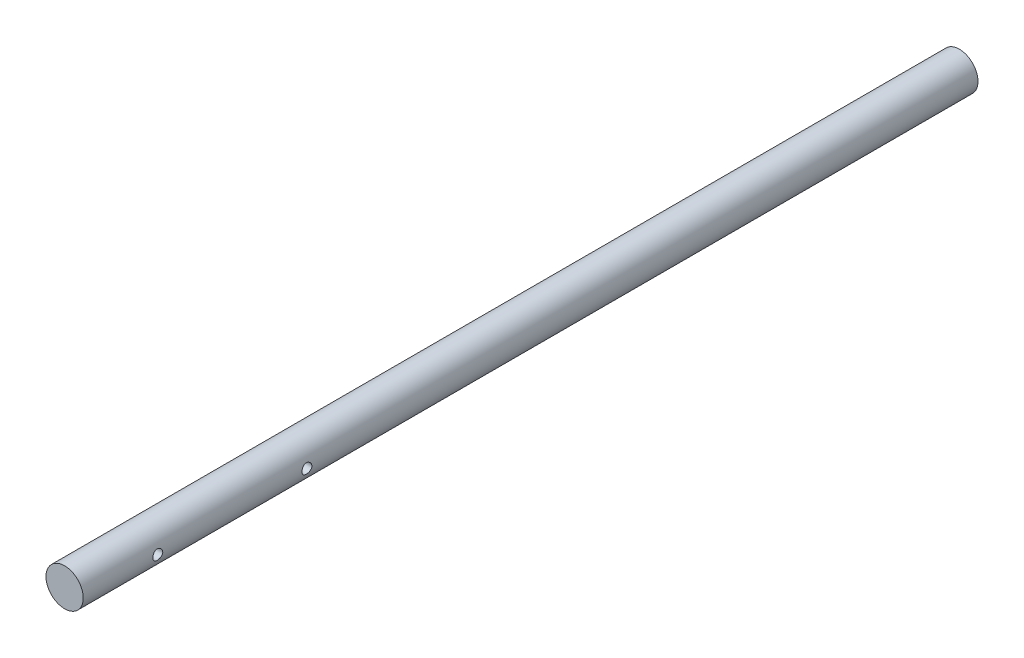
ISO-10303-21;
HEADER;
FILE_DESCRIPTION(('STEP AP214'),'2;1');
FILE_NAME('part.step','',(''),(''),'','','');
FILE_SCHEMA(('AUTOMOTIVE_DESIGN { 1 0 10303 214 1 1 1 1 }'));
ENDSEC;
DATA;
#1=APPLICATION_CONTEXT('core data for automotive mechanical design processes');
#2=APPLICATION_PROTOCOL_DEFINITION('international standard','automotive_design',2000,#1);
#3=PRODUCT_CONTEXT('',#1,'mechanical');
#4=PRODUCT('Part','Part','',(#3));
#5=PRODUCT_RELATED_PRODUCT_CATEGORY('part','',(#4));
#6=PRODUCT_DEFINITION_FORMATION('','',#4);
#7=PRODUCT_DEFINITION_CONTEXT('part definition',#1,'design');
#8=PRODUCT_DEFINITION('design','',#6,#7);
#9=PRODUCT_DEFINITION_SHAPE('','',#8);
#10=(LENGTH_UNIT() NAMED_UNIT(*) SI_UNIT(.MILLI.,.METRE.));
#11=(NAMED_UNIT(*) PLANE_ANGLE_UNIT() SI_UNIT($,.RADIAN.));
#12=(NAMED_UNIT(*) SI_UNIT($,.STERADIAN.) SOLID_ANGLE_UNIT());
#13=UNCERTAINTY_MEASURE_WITH_UNIT(LENGTH_MEASURE(1.E-05),#10,'distance_accuracy_value','');
#14=(GEOMETRIC_REPRESENTATION_CONTEXT(3) GLOBAL_UNCERTAINTY_ASSIGNED_CONTEXT((#13)) GLOBAL_UNIT_ASSIGNED_CONTEXT((#10,
#11,#12)) REPRESENTATION_CONTEXT('',''));
#15=CARTESIAN_POINT('',(0.,0.,0.));
#16=DIRECTION('',(0.,0.,1.));
#17=DIRECTION('',(1.,0.,0.));
#18=AXIS2_PLACEMENT_3D('',#15,#16,#17);
#19=CARTESIAN_POINT('',(-21.6856532851396,-1.03694830499993E-10,1143.));
#20=DIRECTION('',(0.,0.,1.));
#21=DIRECTION('',(1.,0.,0.));
#22=AXIS2_PLACEMENT_3D('',#19,#20,#21);
#23=PLANE('',#22);
#24=CARTESIAN_POINT('',(0.,0.,1143.));
#25=DIRECTION('',(0.,0.,1.));
#26=DIRECTION('',(1.,0.,0.));
#27=AXIS2_PLACEMENT_3D('',#24,#25,#26);
#28=CIRCLE('',#27,12.7);
#29=CARTESIAN_POINT('',(12.7,0.,1143.));
#30=VERTEX_POINT('',#29);
#31=EDGE_CURVE('E53',#30,#30,#28,.F.);
#32=ORIENTED_EDGE('',*,*,#31,.F.);
#33=EDGE_LOOP('',(#32));
#34=FACE_BOUND('',#33,.T.);
#35=ADVANCED_FACE('F14',(#34),#23,.T.);
#36=CARTESIAN_POINT('',(-25.4,0.,1092.2));
#37=DIRECTION('',(-1.,0.,0.));
#38=DIRECTION('',(0.,0.,1.));
#39=AXIS2_PLACEMENT_3D('',#36,#37,#38);
#40=CYLINDRICAL_SURFACE('',#39,3.3782);
#41=CARTESIAN_POINT('',(12.7,0.,1088.8218));
#42=CARTESIAN_POINT('',(12.6999933605372,-0.186020342606474,1088.82181128459));
#43=CARTESIAN_POINT('',(12.695867332988,-0.372262464096379,1088.83723465276));
#44=CARTESIAN_POINT('',(12.6797877928463,-0.73955021698108,1088.89847139542));
#45=CARTESIAN_POINT('',(12.6678198266184,-0.920585607317159,1088.94434088781));
#46=CARTESIAN_POINT('',(12.6373814223825,-1.27185364063102,1089.06487267551));
#47=CARTESIAN_POINT('',(12.6189228160807,-1.44210527918118,1089.13948260371));
#48=CARTESIAN_POINT('',(12.5774590112802,-1.76762100050872,1089.31521688562));
#49=CARTESIAN_POINT('',(12.554454874331,-1.9228885700428,1089.41633505048));
#50=CARTESIAN_POINT('',(12.5057836689968,-2.21769770214195,1089.64470428743));
#51=CARTESIAN_POINT('',(12.4800710423938,-2.35684340313235,1089.77245674211));
#52=CARTESIAN_POINT('',(12.4291728915324,-2.61201629178009,1090.0494023366));
#53=CARTESIAN_POINT('',(12.403987464545,-2.72803924624599,1090.1985993938));
#54=CARTESIAN_POINT('',(12.3565343877839,-2.93557815837609,1090.517328292));
#55=CARTESIAN_POINT('',(12.3343238259698,-3.02664240497215,1090.68716354336));
#56=CARTESIAN_POINT('',(12.2960004660737,-3.17876856491222,1091.04041888794));
#57=CARTESIAN_POINT('',(12.2798865050478,-3.23983620085826,1091.22383638231));
#58=CARTESIAN_POINT('',(12.256048138663,-3.32887077256238,1091.59469324629));
#59=CARTESIAN_POINT('',(12.2481432559455,-3.35755104395233,1091.78194947668));
#60=CARTESIAN_POINT('',(12.2410788191836,-3.38322058468691,1092.15876976435));
#61=CARTESIAN_POINT('',(12.2419176492131,-3.38021570976413,1092.34833338875));
#62=CARTESIAN_POINT('',(12.2520842824537,-3.34316670790743,1092.71882209512));
#63=CARTESIAN_POINT('',(12.2611760874246,-3.30998544183696,1092.89984096847));
#64=CARTESIAN_POINT('',(12.2864465364999,-3.2149071681195,1093.25364623992));
#65=CARTESIAN_POINT('',(12.3026257886389,-3.15300769670125,1093.42643193027));
#66=CARTESIAN_POINT('',(12.3404565781244,-3.00154277190052,1093.76112144869));
#67=CARTESIAN_POINT('',(12.3621676889753,-2.91167361214975,1093.92288081994));
#68=CARTESIAN_POINT('',(12.4085819523928,-2.70704174121837,1094.22931570236));
#69=CARTESIAN_POINT('',(12.4332854980099,-2.59227575831941,1094.37398896434));
#70=CARTESIAN_POINT('',(12.4838810974769,-2.33670212039094,1094.64706635612));
#71=CARTESIAN_POINT('',(12.5097857752129,-2.19517342135551,1094.77479456243));
#72=CARTESIAN_POINT('',(12.5591598914828,-1.89236412155247,1095.00488738205));
#73=CARTESIAN_POINT('',(12.5826282831934,-1.73107509452933,1095.10724111847));
#74=CARTESIAN_POINT('',(12.6246345743652,-1.39204813311243,1095.28400603407));
#75=CARTESIAN_POINT('',(12.6431469899537,-1.2142312840605,1095.3582735694));
#76=CARTESIAN_POINT('',(12.6655031094471,-0.939953184573135,1095.44622406083));
#77=CARTESIAN_POINT('',(12.672051334521,-0.84731172458922,1095.47162625975));
#78=CARTESIAN_POINT('',(12.6831789147544,-0.660102960139958,1095.51446832995));
#79=CARTESIAN_POINT('',(12.6877591818953,-0.565536569043097,1095.53191188962));
#80=CARTESIAN_POINT('',(12.6941721666659,-0.392513241549019,1095.55624078169));
#81=CARTESIAN_POINT('',(12.6963531146455,-0.314254991285739,1095.56446949455));
#82=CARTESIAN_POINT('',(12.6992684375657,-0.157344390753286,1095.57545149779));
#83=CARTESIAN_POINT('',(12.7000028086869,-0.0786920394440842,1095.57820477371));
#84=CARTESIAN_POINT('',(12.6999933605369,0.186020342623133,1095.57818871541));
#85=CARTESIAN_POINT('',(12.6958673329875,0.372262464109051,1095.56276534724));
#86=CARTESIAN_POINT('',(12.679787792846,0.739550216985838,1095.50152860458));
#87=CARTESIAN_POINT('',(12.6678198266183,0.920585607317989,1095.45565911219));
#88=CARTESIAN_POINT('',(12.6373814223828,1.27185364062774,1095.33512732449));
#89=CARTESIAN_POINT('',(12.6189228160812,1.44210527917753,1095.2605173963));
#90=CARTESIAN_POINT('',(12.5774590112808,1.76762100050446,1095.08478311438));
#91=CARTESIAN_POINT('',(12.5544548743317,1.9228885700383,1094.98366494952));
#92=CARTESIAN_POINT('',(12.5057836689976,2.21769770213743,1094.75529571257));
#93=CARTESIAN_POINT('',(12.4800710423946,2.35684340312802,1094.6275432579));
#94=CARTESIAN_POINT('',(12.4291728915333,2.61201629177625,1094.3505976634));
#95=CARTESIAN_POINT('',(12.4039874645458,2.72803924624242,1094.20140060621));
#96=CARTESIAN_POINT('',(12.3565343877847,2.93557815837312,1093.88267170801));
#97=CARTESIAN_POINT('',(12.3343238259705,3.02664240496951,1093.71283645665));
#98=CARTESIAN_POINT('',(12.2960004660742,3.17876856491018,1093.35958111207));
#99=CARTESIAN_POINT('',(12.2798865050483,3.2398362008565,1093.1761636177));
#100=CARTESIAN_POINT('',(12.2560481386633,3.3288707725613,1092.80530675371));
#101=CARTESIAN_POINT('',(12.2481432559457,3.3575510439516,1092.61805052333));
#102=CARTESIAN_POINT('',(12.2410788191836,3.38322058468684,1092.24123023565));
#103=CARTESIAN_POINT('',(12.241917649213,3.38021570976439,1092.05166661126));
#104=CARTESIAN_POINT('',(12.2520842824534,3.34316670790833,1091.68117790489));
#105=CARTESIAN_POINT('',(12.2611760874242,3.30998544183818,1091.50015903153));
#106=CARTESIAN_POINT('',(12.2864465364995,3.21490716812133,1091.14635376009));
#107=CARTESIAN_POINT('',(12.3026257886383,3.15300769670333,1090.97356806974));
#108=CARTESIAN_POINT('',(12.3404565781237,3.00154277190315,1090.63887855132));
#109=CARTESIAN_POINT('',(12.3621676889746,2.91167361215269,1090.47711918006));
#110=CARTESIAN_POINT('',(12.408581952392,2.70704174122187,1090.17068429765));
#111=CARTESIAN_POINT('',(12.4332854980091,2.59227575832314,1090.02601103566));
#112=CARTESIAN_POINT('',(12.4838810974761,2.33670212039518,1089.75293364388));
#113=CARTESIAN_POINT('',(12.5097857752121,2.19517342136,1089.62520543758));
#114=CARTESIAN_POINT('',(12.559159891482,1.89236412155745,1089.39511261795));
#115=CARTESIAN_POINT('',(12.5826282831927,1.73107509453454,1089.29275888153));
#116=CARTESIAN_POINT('',(12.6246345743646,1.39204813311795,1089.11599396594));
#117=CARTESIAN_POINT('',(12.6431469899532,1.21423128406609,1089.04172643061));
#118=CARTESIAN_POINT('',(12.6655031094467,0.939953184578927,1088.95377593917));
#119=CARTESIAN_POINT('',(12.6720513345206,0.847311724595088,1088.92837374025));
#120=CARTESIAN_POINT('',(12.6831789147541,0.660102960145911,1088.88553167005));
#121=CARTESIAN_POINT('',(12.687759181895,0.565536569049061,1088.86808811038));
#122=CARTESIAN_POINT('',(12.6941721666657,0.392513241557402,1088.84375921832));
#123=CARTESIAN_POINT('',(12.6963531146452,0.314254991296555,1088.83553050545));
#124=CARTESIAN_POINT('',(12.6992684375655,0.15734439076897,1088.82454850221));
#125=CARTESIAN_POINT('',(12.7000028086867,0.0786920394622045,1088.82179522629));
#126=CARTESIAN_POINT('',(12.7,0.,1088.8218));
#127=B_SPLINE_CURVE_WITH_KNOTS('',3,(#41,#42,#43,#44,#45,#46,#47,#48,#49,#50,#51,#52,#53,#54,
#55,#56,#57,#58,#59,#60,#61,#62,#63,#64,#65,#66,#67,#68,#69,#70,#71,#72,#73,#74,#75,#76,#77,#78,
#79,#80,#81,#82,#83,#84,#85,#86,#87,#88,#89,#90,#91,#92,#93,#94,#95,#96,#97,#98,#99,#100,#101,
#102,#103,#104,#105,#106,#107,#108,#109,#110,#111,#112,#113,#114,#115,#116,#117,#118,#119,#120,
#121,#122,#123,#124,#125,#126),.UNSPECIFIED.,.T.,.F.,(4,2,2,2,2,2,2,2,2,2,2,2,2,2,2,2,2,2,2,2,2,
2,2,2,2,2,2,2,2,2,2,2,2,2,2,2,2,2,2,2,2,2,4),(0.,0.557772027578806,1.11657499878165,
1.67436457110117,2.2320240325689,2.80132264926697,3.37072539462766,3.94983922959498,
4.52884254119642,5.09482809499832,5.6607090508311,6.21090117790003,6.76114051538032,
7.31757629124609,7.87408523327904,8.44855842732994,9.02327744813122,9.60089728563721,
9.88944767046528,10.1778641921096,10.4138174319529,10.6497712948019,11.2075433223691,
11.7663462935602,12.3241358658781,12.8817953273444,13.4510939440422,14.0204966894033,
14.5996105243707,15.1786138359718,15.7445993897741,16.3104803456068,16.8606724726756,
17.4109118101562,17.9673475860217,18.5238565280545,19.0983297221055,19.6730487429067,
20.2506685804126,20.5392189652407,20.8276354868851,21.0635887267212,21.2995425895629),.UNSPECIFIED.);
#128=CARTESIAN_POINT('',(12.7,0.,1088.8218));
#129=VERTEX_POINT('',#128);
#130=EDGE_CURVE('E49',#129,#129,#127,.T.);
#131=ORIENTED_EDGE('',*,*,#130,.F.);
#132=EDGE_LOOP('',(#131));
#133=FACE_BOUND('',#132,.T.);
#134=CARTESIAN_POINT('',(-12.7,0.,1095.5782));
#135=CARTESIAN_POINT('',(-12.6999933605372,-0.186020342606473,1095.57818871541));
#136=CARTESIAN_POINT('',(-12.695867332988,-0.372262464096378,1095.56276534724));
#137=CARTESIAN_POINT('',(-12.6797877928463,-0.739550216981078,1095.50152860458));
#138=CARTESIAN_POINT('',(-12.6678198266184,-0.920585607317157,1095.45565911219));
#139=CARTESIAN_POINT('',(-12.6373814223825,-1.27185364063101,1095.33512732449));
#140=CARTESIAN_POINT('',(-12.6189228160807,-1.44210527918118,1095.26051739629));
#141=CARTESIAN_POINT('',(-12.5774590112803,-1.76762100050872,1095.08478311438));
#142=CARTESIAN_POINT('',(-12.554454874331,-1.9228885700428,1094.98366494952));
#143=CARTESIAN_POINT('',(-12.5057836689968,-2.21769770214194,1094.75529571257));
#144=CARTESIAN_POINT('',(-12.4800710423938,-2.35684340313235,1094.62754325789));
#145=CARTESIAN_POINT('',(-12.4291728915324,-2.61201629178009,1094.3505976634));
#146=CARTESIAN_POINT('',(-12.403987464545,-2.72803924624598,1094.2014006062));
#147=CARTESIAN_POINT('',(-12.3565343877839,-2.93557815837609,1093.882671708));
#148=CARTESIAN_POINT('',(-12.3343238259698,-3.02664240497215,1093.71283645664));
#149=CARTESIAN_POINT('',(-12.2960004660737,-3.17876856491222,1093.35958111206));
#150=CARTESIAN_POINT('',(-12.2798865050478,-3.23983620085826,1093.17616361769));
#151=CARTESIAN_POINT('',(-12.256048138663,-3.32887077256238,1092.80530675371));
#152=CARTESIAN_POINT('',(-12.2481432559455,-3.35755104395233,1092.61805052332));
#153=CARTESIAN_POINT('',(-12.2410788191836,-3.38322058468691,1092.24123023565));
#154=CARTESIAN_POINT('',(-12.2419176492131,-3.38021570976413,1092.05166661125));
#155=CARTESIAN_POINT('',(-12.2520842824537,-3.34316670790743,1091.68117790488));
#156=CARTESIAN_POINT('',(-12.2611760874246,-3.30998544183696,1091.50015903153));
#157=CARTESIAN_POINT('',(-12.2864465364999,-3.2149071681195,1091.14635376008));
#158=CARTESIAN_POINT('',(-12.3026257886389,-3.15300769670125,1090.97356806973));
#159=CARTESIAN_POINT('',(-12.3404565781244,-3.00154277190052,1090.63887855131));
#160=CARTESIAN_POINT('',(-12.3621676889753,-2.91167361214975,1090.47711918006));
#161=CARTESIAN_POINT('',(-12.4085819523928,-2.70704174121837,1090.17068429764));
#162=CARTESIAN_POINT('',(-12.4332854980099,-2.59227575831941,1090.02601103566));
#163=CARTESIAN_POINT('',(-12.4838810974769,-2.33670212039094,1089.75293364388));
#164=CARTESIAN_POINT('',(-12.5097857752129,-2.19517342135551,1089.62520543757));
#165=CARTESIAN_POINT('',(-12.5591598914828,-1.89236412155247,1089.39511261795));
#166=CARTESIAN_POINT('',(-12.5826282831934,-1.73107509452933,1089.29275888153));
#167=CARTESIAN_POINT('',(-12.6246345743652,-1.39204813311243,1089.11599396593));
#168=CARTESIAN_POINT('',(-12.6431469899537,-1.2142312840605,1089.0417264306));
#169=CARTESIAN_POINT('',(-12.6655031094471,-0.939953184573136,1088.95377593917));
#170=CARTESIAN_POINT('',(-12.672051334521,-0.847311724589221,1088.92837374025));
#171=CARTESIAN_POINT('',(-12.6831789147544,-0.66010296013996,1088.88553167005));
#172=CARTESIAN_POINT('',(-12.6877591818953,-0.565536569043099,1088.86808811038));
#173=CARTESIAN_POINT('',(-12.6941721666659,-0.392513241549015,1088.84375921831));
#174=CARTESIAN_POINT('',(-12.6963531146455,-0.31425499128573,1088.83553050545));
#175=CARTESIAN_POINT('',(-12.6992684375657,-0.157344390753275,1088.82454850221));
#176=CARTESIAN_POINT('',(-12.7000028086869,-0.0786920394440777,1088.82179522629));
#177=CARTESIAN_POINT('',(-12.6999933605369,0.186020342623135,1088.82181128459));
#178=CARTESIAN_POINT('',(-12.6958673329875,0.372262464109053,1088.83723465276));
#179=CARTESIAN_POINT('',(-12.679787792846,0.73955021698584,1088.89847139542));
#180=CARTESIAN_POINT('',(-12.6678198266183,0.920585607317993,1088.94434088781));
#181=CARTESIAN_POINT('',(-12.6373814223828,1.27185364062774,1089.06487267551));
#182=CARTESIAN_POINT('',(-12.6189228160812,1.44210527917753,1089.1394826037));
#183=CARTESIAN_POINT('',(-12.5774590112808,1.76762100050446,1089.31521688562));
#184=CARTESIAN_POINT('',(-12.5544548743317,1.92288857003831,1089.41633505048));
#185=CARTESIAN_POINT('',(-12.5057836689976,2.21769770213748,1089.64470428743));
#186=CARTESIAN_POINT('',(-12.4800710423946,2.35684340312809,1089.7724567421));
#187=CARTESIAN_POINT('',(-12.4291728915332,2.61201629177629,1090.0494023366));
#188=CARTESIAN_POINT('',(-12.4039874645458,2.72803924624245,1090.19859939379));
#189=CARTESIAN_POINT('',(-12.3565343877846,2.93557815837313,1090.51732829199));
#190=CARTESIAN_POINT('',(-12.3343238259705,3.02664240496952,1090.68716354335));
#191=CARTESIAN_POINT('',(-12.2960004660742,3.17876856491017,1091.04041888793));
#192=CARTESIAN_POINT('',(-12.2798865050483,3.2398362008565,1091.22383638231));
#193=CARTESIAN_POINT('',(-12.2560481386633,3.3288707725613,1091.59469324629));
#194=CARTESIAN_POINT('',(-12.2481432559457,3.3575510439516,1091.78194947667));
#195=CARTESIAN_POINT('',(-12.2410788191836,3.38322058468684,1092.15876976435));
#196=CARTESIAN_POINT('',(-12.241917649213,3.38021570976439,1092.34833338874));
#197=CARTESIAN_POINT('',(-12.2520842824534,3.34316670790833,1092.71882209511));
#198=CARTESIAN_POINT('',(-12.2611760874242,3.30998544183818,1092.89984096847));
#199=CARTESIAN_POINT('',(-12.2864465364995,3.21490716812133,1093.25364623991));
#200=CARTESIAN_POINT('',(-12.3026257886383,3.15300769670333,1093.42643193026));
#201=CARTESIAN_POINT('',(-12.3404565781237,3.00154277190315,1093.76112144868));
#202=CARTESIAN_POINT('',(-12.3621676889746,2.91167361215269,1093.92288081994));
#203=CARTESIAN_POINT('',(-12.408581952392,2.70704174122187,1094.22931570235));
#204=CARTESIAN_POINT('',(-12.4332854980091,2.59227575832314,1094.37398896434));
#205=CARTESIAN_POINT('',(-12.4838810974761,2.33670212039518,1094.64706635612));
#206=CARTESIAN_POINT('',(-12.5097857752121,2.19517342136,1094.77479456242));
#207=CARTESIAN_POINT('',(-12.559159891482,1.89236412155745,1095.00488738205));
#208=CARTESIAN_POINT('',(-12.5826282831927,1.73107509453454,1095.10724111847));
#209=CARTESIAN_POINT('',(-12.6246345743646,1.39204813311794,1095.28400603406));
#210=CARTESIAN_POINT('',(-12.6431469899532,1.21423128406609,1095.35827356939));
#211=CARTESIAN_POINT('',(-12.6655031094467,0.939953184578925,1095.44622406083));
#212=CARTESIAN_POINT('',(-12.6720513345206,0.847311724595087,1095.47162625975));
#213=CARTESIAN_POINT('',(-12.6831789147541,0.66010296014591,1095.51446832995));
#214=CARTESIAN_POINT('',(-12.687759181895,0.565536569049058,1095.53191188962));
#215=CARTESIAN_POINT('',(-12.6941721666657,0.3925132415574,1095.55624078168));
#216=CARTESIAN_POINT('',(-12.6963531146452,0.314254991296554,1095.56446949455));
#217=CARTESIAN_POINT('',(-12.6992684375655,0.15734439076897,1095.57545149779));
#218=CARTESIAN_POINT('',(-12.7000028086867,0.0786920394622056,1095.57820477371));
#219=CARTESIAN_POINT('',(-12.7,0.,1095.5782));
#220=B_SPLINE_CURVE_WITH_KNOTS('',3,(#134,#135,#136,#137,#138,#139,#140,#141,#142,#143,#144,
#145,#146,#147,#148,#149,#150,#151,#152,#153,#154,#155,#156,#157,#158,#159,#160,#161,#162,#163,
#164,#165,#166,#167,#168,#169,#170,#171,#172,#173,#174,#175,#176,#177,#178,#179,#180,#181,#182,
#183,#184,#185,#186,#187,#188,#189,#190,#191,#192,#193,#194,#195,#196,#197,#198,#199,#200,#201,
#202,#203,#204,#205,#206,#207,#208,#209,#210,#211,#212,#213,#214,#215,#216,#217,#218,#219),
.UNSPECIFIED.,.T.,.F.,(4,2,2,2,2,2,2,2,2,2,2,2,2,2,2,2,2,2,2,2,2,2,2,2,2,2,2,2,2,2,2,2,2,2,2,2,
2,2,2,2,2,2,4),(0.,0.557772027578806,1.11657499878165,1.67436457110117,2.2320240325689,
2.80132264926697,3.37072539462766,3.94983922959499,4.52884254119643,5.09482809499832,
5.6607090508311,6.21090117790003,6.76114051538032,7.31757629124609,7.87408523327904,
8.44855842732994,9.02327744813122,9.60089728563721,9.88944767046528,10.1778641921096,
10.4138174319529,10.6497712948019,11.2075433223691,11.7663462935602,12.3241358658781,
12.8817953273444,13.4510939440425,14.0204966894033,14.5996105243707,15.1786138359718,
15.7445993897741,16.3104803456068,16.8606724726756,17.4109118101562,17.9673475860217,
18.5238565280545,19.0983297221055,19.6730487429067,20.2506685804126,20.5392189652407,
20.8276354868851,21.0635887267212,21.2995425895629),.UNSPECIFIED.);
#221=CARTESIAN_POINT('',(-12.7,0.,1095.5782));
#222=VERTEX_POINT('',#221);
#223=EDGE_CURVE('E30',#222,#222,#220,.T.);
#224=ORIENTED_EDGE('',*,*,#223,.F.);
#225=EDGE_LOOP('',(#224));
#226=FACE_BOUND('',#225,.T.);
#227=ADVANCED_FACE('F54',(#133,#226),#40,.F.);
#228=CARTESIAN_POINT('',(-25.4,0.,990.6));
#229=DIRECTION('',(-1.,0.,0.));
#230=DIRECTION('',(0.,0.,1.));
#231=AXIS2_PLACEMENT_3D('',#228,#229,#230);
#232=CYLINDRICAL_SURFACE('',#231,3.3782);
#233=CARTESIAN_POINT('',(12.7,0.,987.2218));
#234=CARTESIAN_POINT('',(12.6999933605372,-0.186020342606472,987.221811284591));
#235=CARTESIAN_POINT('',(12.695867332988,-0.372262464096388,987.23723465276));
#236=CARTESIAN_POINT('',(12.6797877928463,-0.739550216981074,987.298471395422));
#237=CARTESIAN_POINT('',(12.6678198266184,-0.920585607317128,987.344340887814));
#238=CARTESIAN_POINT('',(12.6373814223825,-1.27185364063097,987.464872675508));
#239=CARTESIAN_POINT('',(12.6189228160807,-1.44210527918115,987.539482603706));
#240=CARTESIAN_POINT('',(12.5774590112803,-1.76762100050868,987.715216885621));
#241=CARTESIAN_POINT('',(12.554454874331,-1.92288857004274,987.816335050482));
#242=CARTESIAN_POINT('',(12.5057836689968,-2.21769770214186,988.044704287434));
#243=CARTESIAN_POINT('',(12.4800710423938,-2.35684340313227,988.172456742108));
#244=CARTESIAN_POINT('',(12.4291728915324,-2.61201629178005,988.449402336601));
#245=CARTESIAN_POINT('',(12.403987464545,-2.72803924624597,988.598599393796));
#246=CARTESIAN_POINT('',(12.3565343877839,-2.93557815837612,988.917328292));
#247=CARTESIAN_POINT('',(12.3343238259698,-3.02664240497223,989.08716354336));
#248=CARTESIAN_POINT('',(12.2960004660737,-3.17876856491229,989.440418887936));
#249=CARTESIAN_POINT('',(12.2798865050478,-3.2398362008583,989.623836382311));
#250=CARTESIAN_POINT('',(12.256048138663,-3.3288707725624,989.994693246293));
#251=CARTESIAN_POINT('',(12.2481432559455,-3.35755104395234,990.181949476677));
#252=CARTESIAN_POINT('',(12.2410788191836,-3.38322058468691,990.558769764353));
#253=CARTESIAN_POINT('',(12.2419176492131,-3.38021570976415,990.748333388748));
#254=CARTESIAN_POINT('',(12.2520842824537,-3.34316670790745,991.118822095118));
#255=CARTESIAN_POINT('',(12.2611760874246,-3.30998544183698,991.299840968474));
#256=CARTESIAN_POINT('',(12.2864465364999,-3.21490716811954,991.653646239917));
#257=CARTESIAN_POINT('',(12.3026257886389,-3.15300769670127,991.826431930265));
#258=CARTESIAN_POINT('',(12.3404565781244,-3.00154277190052,992.161121448685));
#259=CARTESIAN_POINT('',(12.3621676889753,-2.91167361214976,992.322880819944));
#260=CARTESIAN_POINT('',(12.4085819523928,-2.70704174121841,992.629315702355));
#261=CARTESIAN_POINT('',(12.4332854980098,-2.59227575831949,992.773988964341));
#262=CARTESIAN_POINT('',(12.4838810974768,-2.33670212039105,993.047066356122));
#263=CARTESIAN_POINT('',(12.5097857752128,-2.1951734213556,993.174794562425));
#264=CARTESIAN_POINT('',(12.5591598914828,-1.89236412155257,993.404887382049));
#265=CARTESIAN_POINT('',(12.5826282831934,-1.73107509452945,993.507241118472));
#266=CARTESIAN_POINT('',(12.6246345743652,-1.39204813311254,993.684006034066));
#267=CARTESIAN_POINT('',(12.6431469899537,-1.21423128406058,993.758273569395));
#268=CARTESIAN_POINT('',(12.6655031094471,-0.939953184573195,993.846224060832));
#269=CARTESIAN_POINT('',(12.672051334521,-0.84731172458928,993.871626259751));
#270=CARTESIAN_POINT('',(12.6831789147544,-0.660102960140004,993.914468329952));
#271=CARTESIAN_POINT('',(12.6877591818953,-0.565536569043128,993.93191188962));
#272=CARTESIAN_POINT('',(12.6941721666659,-0.392513241549036,993.956240781685));
#273=CARTESIAN_POINT('',(12.6963531146455,-0.314254991285756,993.964469494546));
#274=CARTESIAN_POINT('',(12.6992684375657,-0.157344390753301,993.975451497788));
#275=CARTESIAN_POINT('',(12.7000028086869,-0.078692039444099,993.978204773712));
#276=CARTESIAN_POINT('',(12.6999933605369,0.186020342623104,993.978188715408));
#277=CARTESIAN_POINT('',(12.6958673329875,0.372262464108998,993.962765347238));
#278=CARTESIAN_POINT('',(12.679787792846,0.739550216985783,993.901528604576));
#279=CARTESIAN_POINT('',(12.6678198266183,0.920585607317959,993.855659112186));
#280=CARTESIAN_POINT('',(12.6373814223828,1.27185364062774,993.735127324493));
#281=CARTESIAN_POINT('',(12.6189228160811,1.44210527917755,993.660517396295));
#282=CARTESIAN_POINT('',(12.5774590112808,1.76762100050446,993.484783114382));
#283=CARTESIAN_POINT('',(12.5544548743317,1.92288857003827,993.383664949521));
#284=CARTESIAN_POINT('',(12.5057836689976,2.21769770213738,993.15529571257));
#285=CARTESIAN_POINT('',(12.4800710423946,2.35684340312796,993.027543257896));
#286=CARTESIAN_POINT('',(12.4291728915333,2.61201629177619,992.750597663403));
#287=CARTESIAN_POINT('',(12.4039874645458,2.72803924624238,992.601400606209));
#288=CARTESIAN_POINT('',(12.3565343877847,2.93557815837312,992.282671708005));
#289=CARTESIAN_POINT('',(12.3343238259705,3.02664240496952,992.112836456646));
#290=CARTESIAN_POINT('',(12.2960004660742,3.17876856491021,991.75958111207));
#291=CARTESIAN_POINT('',(12.2798865050483,3.23983620085655,991.576163617695));
#292=CARTESIAN_POINT('',(12.2560481386633,3.32887077256132,991.205306753712));
#293=CARTESIAN_POINT('',(12.2481432559457,3.35755104395159,991.018050523329));
#294=CARTESIAN_POINT('',(12.2410788191836,3.38322058468684,990.641230235653));
#295=CARTESIAN_POINT('',(12.241917649213,3.38021570976441,990.451666611258));
#296=CARTESIAN_POINT('',(12.2520842824534,3.34316670790834,990.081177904888));
#297=CARTESIAN_POINT('',(12.2611760874242,3.30998544183818,989.900159031531));
#298=CARTESIAN_POINT('',(12.2864465364995,3.21490716812133,989.546353760088));
#299=CARTESIAN_POINT('',(12.3026257886383,3.15300769670335,989.37356806974));
#300=CARTESIAN_POINT('',(12.3404565781237,3.0015427719032,989.03887855132));
#301=CARTESIAN_POINT('',(12.3621676889746,2.91167361215276,988.877119180061));
#302=CARTESIAN_POINT('',(12.408581952392,2.70704174122199,988.57068429765));
#303=CARTESIAN_POINT('',(12.433285498009,2.5922757583233,988.426011035664));
#304=CARTESIAN_POINT('',(12.483881097476,2.33670212039537,988.152933643882));
#305=CARTESIAN_POINT('',(12.509785775212,2.1951734213602,988.025205437579));
#306=CARTESIAN_POINT('',(12.559159891482,1.89236412155764,987.795112617955));
#307=CARTESIAN_POINT('',(12.5826282831927,1.73107509453471,987.692758881531));
#308=CARTESIAN_POINT('',(12.6246345743646,1.39204813311808,987.515993965937));
#309=CARTESIAN_POINT('',(12.6431469899532,1.21423128406621,987.441726430607));
#310=CARTESIAN_POINT('',(12.6655031094467,0.939953184578959,987.35377593917));
#311=CARTESIAN_POINT('',(12.6720513345206,0.847311724595095,987.32837374025));
#312=CARTESIAN_POINT('',(12.6831789147541,0.660102960145885,987.285531670049));
#313=CARTESIAN_POINT('',(12.687759181895,0.565536569049026,987.268088110381));
#314=CARTESIAN_POINT('',(12.6941721666657,0.392513241557364,987.243759218316));
#315=CARTESIAN_POINT('',(12.6963531146452,0.314254991296526,987.235530505455));
#316=CARTESIAN_POINT('',(12.6992684375655,0.157344390768957,987.224548502212));
#317=CARTESIAN_POINT('',(12.7000028086867,0.0786920394621994,987.221795226288));
#318=CARTESIAN_POINT('',(12.7,0.,987.2218));
#319=B_SPLINE_CURVE_WITH_KNOTS('',3,(#233,#234,#235,#236,#237,#238,#239,#240,#241,#242,#243,
#244,#245,#246,#247,#248,#249,#250,#251,#252,#253,#254,#255,#256,#257,#258,#259,#260,#261,#262,
#263,#264,#265,#266,#267,#268,#269,#270,#271,#272,#273,#274,#275,#276,#277,#278,#279,#280,#281,
#282,#283,#284,#285,#286,#287,#288,#289,#290,#291,#292,#293,#294,#295,#296,#297,#298,#299,#300,
#301,#302,#303,#304,#305,#306,#307,#308,#309,#310,#311,#312,#313,#314,#315,#316,#317,#318),
.UNSPECIFIED.,.T.,.F.,(4,2,2,2,2,2,2,2,2,2,2,2,2,2,2,2,2,2,2,2,2,2,2,2,2,2,2,2,2,2,2,2,2,2,2,2,
2,2,2,2,2,2,4),(0.,0.557772027578797,1.11657499878164,1.67436457110111,2.23202403256881,
2.80132264926678,3.37072539462782,3.94983922959517,4.52884254119648,5.09482809499848,
5.66070905083115,6.21090117789975,6.76114051538026,7.31757629124602,7.87408523327882,
8.44855842732983,9.02327744813114,9.60089728563713,9.88944767046521,10.1778641921096,
10.4138174319529,10.6497712948019,11.207543322369,11.7663462935601,12.3241358658782,
12.8817953273443,13.4510939440422,14.0204966894031,14.5996105243705,15.1786138359719,
15.7445993897739,16.3104803456068,16.8606724726754,17.410911810156,17.9673475860215,
18.5238565280543,19.0983297221052,19.6730487429065,20.2506685804126,20.5392189652407,
20.8276354868851,21.0635887267211,21.2995425895629),.UNSPECIFIED.);
#320=CARTESIAN_POINT('',(12.7,0.,987.2218));
#321=VERTEX_POINT('',#320);
#322=EDGE_CURVE('E17',#321,#321,#319,.T.);
#323=ORIENTED_EDGE('',*,*,#322,.F.);
#324=EDGE_LOOP('',(#323));
#325=FACE_BOUND('',#324,.T.);
#326=CARTESIAN_POINT('',(-12.7,0.,993.9782));
#327=CARTESIAN_POINT('',(-12.6999933605372,-0.186020342606471,993.978188715409));
#328=CARTESIAN_POINT('',(-12.695867332988,-0.372262464096387,993.96276534724));
#329=CARTESIAN_POINT('',(-12.6797877928463,-0.739550216981073,993.901528604577));
#330=CARTESIAN_POINT('',(-12.6678198266184,-0.920585607317126,993.855659112186));
#331=CARTESIAN_POINT('',(-12.6373814223825,-1.27185364063097,993.735127324492));
#332=CARTESIAN_POINT('',(-12.6189228160807,-1.44210527918115,993.660517396294));
#333=CARTESIAN_POINT('',(-12.5774590112803,-1.76762100050868,993.484783114379));
#334=CARTESIAN_POINT('',(-12.554454874331,-1.92288857004273,993.383664949518));
#335=CARTESIAN_POINT('',(-12.5057836689968,-2.21769770214185,993.155295712566));
#336=CARTESIAN_POINT('',(-12.4800710423938,-2.35684340313227,993.027543257892));
#337=CARTESIAN_POINT('',(-12.4291728915324,-2.61201629178005,992.750597663399));
#338=CARTESIAN_POINT('',(-12.403987464545,-2.72803924624598,992.601400606204));
#339=CARTESIAN_POINT('',(-12.3565343877839,-2.93557815837609,992.282671708));
#340=CARTESIAN_POINT('',(-12.3343238259698,-3.02664240497216,992.11283645664));
#341=CARTESIAN_POINT('',(-12.2960004660737,-3.17876856491224,991.759581112064));
#342=CARTESIAN_POINT('',(-12.2798865050478,-3.23983620085829,991.576163617689));
#343=CARTESIAN_POINT('',(-12.256048138663,-3.3288707725624,991.205306753706));
#344=CARTESIAN_POINT('',(-12.2481432559455,-3.35755104395234,991.018050523323));
#345=CARTESIAN_POINT('',(-12.2410788191836,-3.38322058468691,990.641230235647));
#346=CARTESIAN_POINT('',(-12.2419176492131,-3.38021570976415,990.451666611252));
#347=CARTESIAN_POINT('',(-12.2520842824537,-3.34316670790745,990.081177904882));
#348=CARTESIAN_POINT('',(-12.2611760874246,-3.30998544183698,989.900159031526));
#349=CARTESIAN_POINT('',(-12.2864465364999,-3.21490716811954,989.546353760083));
#350=CARTESIAN_POINT('',(-12.3026257886389,-3.15300769670127,989.373568069734));
#351=CARTESIAN_POINT('',(-12.3404565781244,-3.00154277190055,989.038878551315));
#352=CARTESIAN_POINT('',(-12.3621676889753,-2.91167361214982,988.877119180056));
#353=CARTESIAN_POINT('',(-12.4085819523928,-2.7070417412185,988.570684297645));
#354=CARTESIAN_POINT('',(-12.4332854980098,-2.59227575831954,988.426011035659));
#355=CARTESIAN_POINT('',(-12.4838810974768,-2.33670212039106,988.152933643878));
#356=CARTESIAN_POINT('',(-12.5097857752128,-2.19517342135562,988.025205437575));
#357=CARTESIAN_POINT('',(-12.5591598914828,-1.8923641215526,987.795112617951));
#358=CARTESIAN_POINT('',(-12.5826282831934,-1.73107509452948,987.692758881528));
#359=CARTESIAN_POINT('',(-12.6246345743652,-1.39204813311256,987.515993965934));
#360=CARTESIAN_POINT('',(-12.6431469899537,-1.2142312840606,987.441726430604));
#361=CARTESIAN_POINT('',(-12.6655031094471,-0.93995318457323,987.353775939168));
#362=CARTESIAN_POINT('',(-12.672051334521,-0.847311724589318,987.328373740249));
#363=CARTESIAN_POINT('',(-12.6831789147544,-0.660102960140032,987.285531670047));
#364=CARTESIAN_POINT('',(-12.6877591818953,-0.565536569043143,987.26808811038));
#365=CARTESIAN_POINT('',(-12.6941721666659,-0.392513241549038,987.243759218315));
#366=CARTESIAN_POINT('',(-12.6963531146455,-0.314254991285757,987.235530505454));
#367=CARTESIAN_POINT('',(-12.6992684375657,-0.157344390753302,987.224548502212));
#368=CARTESIAN_POINT('',(-12.7000028086869,-0.0786920394440997,987.221795226288));
#369=CARTESIAN_POINT('',(-12.6999933605369,0.186020342623106,987.221811284592));
#370=CARTESIAN_POINT('',(-12.6958673329875,0.372262464109002,987.237234652762));
#371=CARTESIAN_POINT('',(-12.679787792846,0.739550216985785,987.298471395424));
#372=CARTESIAN_POINT('',(-12.6678198266183,0.920585607317955,987.344340887814));
#373=CARTESIAN_POINT('',(-12.6373814223828,1.27185364062773,987.464872675507));
#374=CARTESIAN_POINT('',(-12.6189228160812,1.44210527917753,987.539482603705));
#375=CARTESIAN_POINT('',(-12.5774590112808,1.76762100050444,987.715216885618));
#376=CARTESIAN_POINT('',(-12.5544548743317,1.92288857003826,987.816335050479));
#377=CARTESIAN_POINT('',(-12.5057836689976,2.21769770213737,988.04470428743));
#378=CARTESIAN_POINT('',(-12.4800710423946,2.35684340312796,988.172456742104));
#379=CARTESIAN_POINT('',(-12.4291728915333,2.61201629177619,988.449402336596));
#380=CARTESIAN_POINT('',(-12.4039874645458,2.72803924624239,988.598599393791));
#381=CARTESIAN_POINT('',(-12.3565343877847,2.93557815837312,988.917328291994));
#382=CARTESIAN_POINT('',(-12.3343238259705,3.02664240496952,989.087163543354));
#383=CARTESIAN_POINT('',(-12.2960004660742,3.17876856491021,989.44041888793));
#384=CARTESIAN_POINT('',(-12.2798865050483,3.23983620085655,989.623836382305));
#385=CARTESIAN_POINT('',(-12.2560481386633,3.32887077256132,989.994693246287));
#386=CARTESIAN_POINT('',(-12.2481432559457,3.35755104395159,990.181949476671));
#387=CARTESIAN_POINT('',(-12.2410788191836,3.38322058468684,990.558769764347));
#388=CARTESIAN_POINT('',(-12.241917649213,3.38021570976441,990.748333388742));
#389=CARTESIAN_POINT('',(-12.2520842824534,3.34316670790834,991.118822095112));
#390=CARTESIAN_POINT('',(-12.2611760874242,3.30998544183818,991.299840968469));
#391=CARTESIAN_POINT('',(-12.2864465364995,3.21490716812133,991.653646239912));
#392=CARTESIAN_POINT('',(-12.3026257886383,3.15300769670334,991.82643193026));
#393=CARTESIAN_POINT('',(-12.3404565781237,3.00154277190319,992.16112144868));
#394=CARTESIAN_POINT('',(-12.3621676889746,2.91167361215273,992.322880819939));
#395=CARTESIAN_POINT('',(-12.408581952392,2.70704174122192,992.62931570235));
#396=CARTESIAN_POINT('',(-12.4332854980091,2.59227575832322,992.773988964336));
#397=CARTESIAN_POINT('',(-12.4838810974761,2.33670212039528,993.047066356118));
#398=CARTESIAN_POINT('',(-12.509785775212,2.19517342136012,993.174794562421));
#399=CARTESIAN_POINT('',(-12.559159891482,1.89236412155758,993.404887382045));
#400=CARTESIAN_POINT('',(-12.5826282831927,1.73107509453465,993.507241118469));
#401=CARTESIAN_POINT('',(-12.6246345743646,1.39204813311803,993.684006034063));
#402=CARTESIAN_POINT('',(-12.6431469899532,1.21423128406616,993.758273569393));
#403=CARTESIAN_POINT('',(-12.6655031094467,0.939953184578926,993.84622406083));
#404=CARTESIAN_POINT('',(-12.6720513345206,0.847311724595066,993.871626259749));
#405=CARTESIAN_POINT('',(-12.6831789147541,0.660102960145863,993.914468329951));
#406=CARTESIAN_POINT('',(-12.687759181895,0.565536569049006,993.931911889619));
#407=CARTESIAN_POINT('',(-12.6941721666657,0.392513241557351,993.956240781684));
#408=CARTESIAN_POINT('',(-12.6963531146452,0.314254991296515,993.964469494545));
#409=CARTESIAN_POINT('',(-12.6992684375655,0.157344390768952,993.975451497788));
#410=CARTESIAN_POINT('',(-12.7000028086867,0.0786920394621973,993.978204773712));
#411=CARTESIAN_POINT('',(-12.7,0.,993.9782));
#412=B_SPLINE_CURVE_WITH_KNOTS('',3,(#326,#327,#328,#329,#330,#331,#332,#333,#334,#335,#336,
#337,#338,#339,#340,#341,#342,#343,#344,#345,#346,#347,#348,#349,#350,#351,#352,#353,#354,#355,
#356,#357,#358,#359,#360,#361,#362,#363,#364,#365,#366,#367,#368,#369,#370,#371,#372,#373,#374,
#375,#376,#377,#378,#379,#380,#381,#382,#383,#384,#385,#386,#387,#388,#389,#390,#391,#392,#393,
#394,#395,#396,#397,#398,#399,#400,#401,#402,#403,#404,#405,#406,#407,#408,#409,#410,#411),
.UNSPECIFIED.,.T.,.F.,(4,2,2,2,2,2,2,2,2,2,2,2,2,2,2,2,2,2,2,2,2,2,2,2,2,2,2,2,2,2,2,2,2,2,2,2,
2,2,2,2,2,2,4),(0.,0.557772027578797,1.11657499878164,1.67436457110111,2.23202403256881,
2.80132264926678,3.37072539462782,3.94983922959503,4.52884254119648,5.09482809499848,
5.66070905083114,6.21090117789974,6.76114051538026,7.31757629124587,7.87408523327882,
8.44855842732971,9.02327744813113,9.60089728563709,9.88944767046517,10.1778641921095,
10.4138174319529,10.6497712948019,11.207543322369,11.7663462935601,12.3241358658781,
12.8817953273443,13.4510939440422,14.0204966894031,14.5996105243705,15.1786138359719,
15.7445993897739,16.3104803456068,16.8606724726754,17.410911810156,17.9673475860217,
18.5238565280544,19.0983297221052,19.6730487429065,20.2506685804126,20.5392189652407,
20.8276354868851,21.0635887267211,21.2995425895629),.UNSPECIFIED.);
#413=CARTESIAN_POINT('',(-12.7,0.,993.9782));
#414=VERTEX_POINT('',#413);
#415=EDGE_CURVE('E25',#414,#414,#412,.T.);
#416=ORIENTED_EDGE('',*,*,#415,.F.);
#417=EDGE_LOOP('',(#416));
#418=FACE_BOUND('',#417,.T.);
#419=ADVANCED_FACE('F38',(#325,#418),#232,.F.);
#420=CARTESIAN_POINT('',(-21.6856532851396,-1.03694830499993E-10,533.4));
#421=DIRECTION('',(0.,0.,1.));
#422=DIRECTION('',(1.,0.,0.));
#423=AXIS2_PLACEMENT_3D('',#420,#421,#422);
#424=PLANE('',#423);
#425=CARTESIAN_POINT('',(0.,0.,533.4));
#426=DIRECTION('',(0.,0.,1.));
#427=DIRECTION('',(1.,0.,0.));
#428=AXIS2_PLACEMENT_3D('',#425,#426,#427);
#429=CIRCLE('',#428,12.7);
#430=CARTESIAN_POINT('',(12.7,0.,533.4));
#431=VERTEX_POINT('',#430);
#432=EDGE_CURVE('E10',#431,#431,#429,.T.);
#433=ORIENTED_EDGE('',*,*,#432,.F.);
#434=EDGE_LOOP('',(#433));
#435=FACE_BOUND('',#434,.T.);
#436=ADVANCED_FACE('F44',(#435),#424,.F.);
#437=CARTESIAN_POINT('',(0.,0.,1143.));
#438=DIRECTION('',(0.,0.,1.));
#439=DIRECTION('',(1.,0.,0.));
#440=AXIS2_PLACEMENT_3D('',#437,#438,#439);
#441=CYLINDRICAL_SURFACE('',#440,12.7);
#442=ORIENTED_EDGE('',*,*,#322,.T.);
#443=EDGE_LOOP('',(#442));
#444=FACE_BOUND('',#443,.T.);
#445=ORIENTED_EDGE('',*,*,#130,.T.);
#446=EDGE_LOOP('',(#445));
#447=FACE_BOUND('',#446,.T.);
#448=ORIENTED_EDGE('',*,*,#31,.T.);
#449=EDGE_LOOP('',(#448));
#450=FACE_BOUND('',#449,.T.);
#451=ORIENTED_EDGE('',*,*,#223,.T.);
#452=EDGE_LOOP('',(#451));
#453=FACE_BOUND('',#452,.T.);
#454=ORIENTED_EDGE('',*,*,#415,.T.);
#455=EDGE_LOOP('',(#454));
#456=FACE_BOUND('',#455,.T.);
#457=ORIENTED_EDGE('',*,*,#432,.T.);
#458=EDGE_LOOP('',(#457));
#459=FACE_BOUND('',#458,.T.);
#460=ADVANCED_FACE('F41',(#444,#447,#450,#453,#456,#459),#441,.T.);
#461=CLOSED_SHELL('',(#35,#227,#419,#436,#460));
#462=MANIFOLD_SOLID_BREP('B1',#461);
#463=ADVANCED_BREP_SHAPE_REPRESENTATION('',(#18,#462),#14);
#464=SHAPE_DEFINITION_REPRESENTATION(#9,#463);
ENDSEC;
END-ISO-10303-21;
